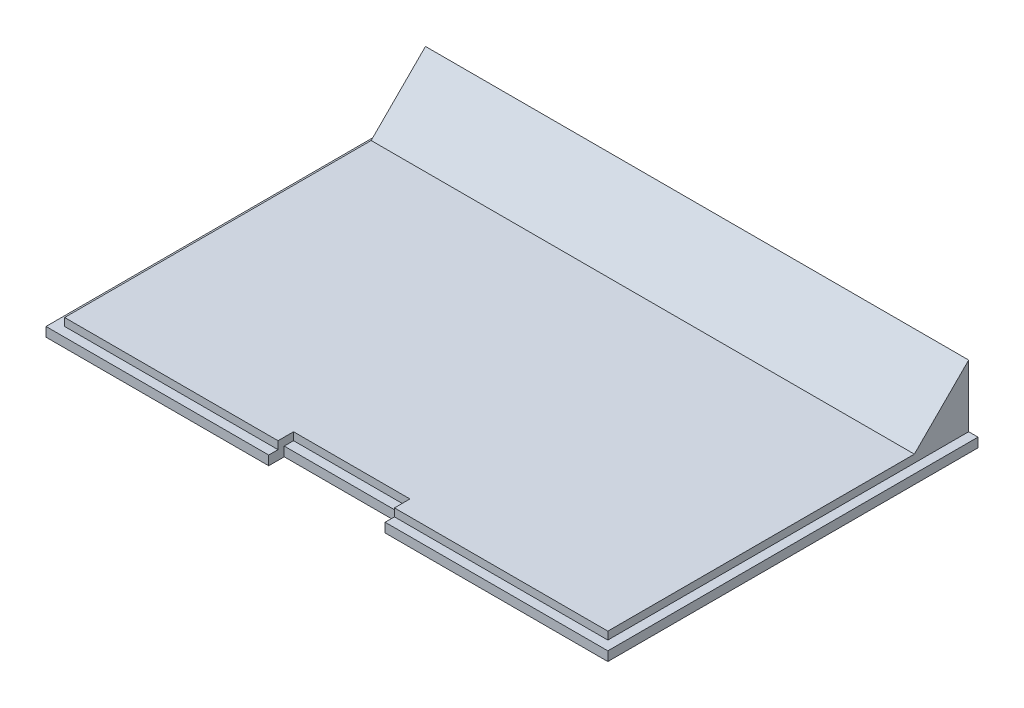
ISO-10303-21;
HEADER;
FILE_DESCRIPTION(('STEP AP214'),'2;1');
FILE_NAME('part.step','',(''),(''),'','','');
FILE_SCHEMA(('AUTOMOTIVE_DESIGN { 1 0 10303 214 1 1 1 1 }'));
ENDSEC;
DATA;
#1=APPLICATION_CONTEXT('core data for automotive mechanical design processes');
#2=APPLICATION_PROTOCOL_DEFINITION('international standard','automotive_design',2000,#1);
#3=PRODUCT_CONTEXT('',#1,'mechanical');
#4=PRODUCT('Part','Part','',(#3));
#5=PRODUCT_RELATED_PRODUCT_CATEGORY('part','',(#4));
#6=PRODUCT_DEFINITION_FORMATION('','',#4);
#7=PRODUCT_DEFINITION_CONTEXT('part definition',#1,'design');
#8=PRODUCT_DEFINITION('design','',#6,#7);
#9=PRODUCT_DEFINITION_SHAPE('','',#8);
#10=(LENGTH_UNIT() NAMED_UNIT(*) SI_UNIT(.MILLI.,.METRE.));
#11=(NAMED_UNIT(*) PLANE_ANGLE_UNIT() SI_UNIT($,.RADIAN.));
#12=(NAMED_UNIT(*) SI_UNIT($,.STERADIAN.) SOLID_ANGLE_UNIT());
#13=UNCERTAINTY_MEASURE_WITH_UNIT(LENGTH_MEASURE(1.E-05),#10,'distance_accuracy_value','');
#14=(GEOMETRIC_REPRESENTATION_CONTEXT(3) GLOBAL_UNCERTAINTY_ASSIGNED_CONTEXT((#13)) GLOBAL_UNIT_ASSIGNED_CONTEXT((#10,
#11,#12)) REPRESENTATION_CONTEXT('',''));
#15=CARTESIAN_POINT('',(0.,0.,0.));
#16=DIRECTION('',(0.,0.,1.));
#17=DIRECTION('',(1.,0.,0.));
#18=AXIS2_PLACEMENT_3D('',#15,#16,#17);
#19=CARTESIAN_POINT('',(0.,1.2,0.));
#20=DIRECTION('',(0.,-1.,0.));
#21=DIRECTION('',(0.,0.,-1.));
#22=AXIS2_PLACEMENT_3D('',#19,#20,#21);
#23=PLANE('',#22);
#24=DIRECTION('',(1.,0.,0.));
#25=VECTOR('',#24,1.);
#26=CARTESIAN_POINT('',(0.,1.2,0.));
#27=LINE('',#26,#25);
#28=CARTESIAN_POINT('',(0.,1.2,0.));
#29=VERTEX_POINT('',#28);
#30=CARTESIAN_POINT('',(28.7,1.2,0.));
#31=VERTEX_POINT('',#30);
#32=EDGE_CURVE('E275',#29,#31,#27,.T.);
#33=ORIENTED_EDGE('',*,*,#32,.T.);
#34=DIRECTION('',(0.,0.,-1.));
#35=VECTOR('',#34,1.);
#36=CARTESIAN_POINT('',(28.7,1.2,0.));
#37=LINE('',#36,#35);
#38=CARTESIAN_POINT('',(28.7,1.2,-1.20000000000001));
#39=VERTEX_POINT('',#38);
#40=EDGE_CURVE('E212',#31,#39,#37,.T.);
#41=ORIENTED_EDGE('',*,*,#40,.T.);
#42=DIRECTION('',(1.,0.,0.));
#43=VECTOR('',#42,1.);
#44=CARTESIAN_POINT('',(1.20000000000001,1.2,-1.20000000000001));
#45=LINE('',#44,#43);
#46=CARTESIAN_POINT('',(1.20000000000001,1.2,-1.20000000000001));
#47=VERTEX_POINT('',#46);
#48=EDGE_CURVE('E246',#47,#39,#45,.T.);
#49=ORIENTED_EDGE('',*,*,#48,.F.);
#50=DIRECTION('',(0.,0.,1.));
#51=VECTOR('',#50,1.);
#52=CARTESIAN_POINT('',(1.20000000000001,1.2,-47.7));
#53=LINE('',#52,#51);
#54=CARTESIAN_POINT('',(1.20000000000001,1.2,-47.7));
#55=VERTEX_POINT('',#54);
#56=EDGE_CURVE('E224',#55,#47,#53,.T.);
#57=ORIENTED_EDGE('',*,*,#56,.F.);
#58=DIRECTION('',(-1.,0.,0.));
#59=VECTOR('',#58,1.);
#60=CARTESIAN_POINT('',(0.,1.2,-47.7));
#61=LINE('',#60,#59);
#62=CARTESIAN_POINT('',(0.,1.2,-47.7));
#63=VERTEX_POINT('',#62);
#64=EDGE_CURVE('E282',#55,#63,#61,.T.);
#65=ORIENTED_EDGE('',*,*,#64,.T.);
#66=DIRECTION('',(0.,0.,1.));
#67=VECTOR('',#66,1.);
#68=CARTESIAN_POINT('',(0.,1.2,0.));
#69=LINE('',#68,#67);
#70=EDGE_CURVE('E269',#63,#29,#69,.T.);
#71=ORIENTED_EDGE('',*,*,#70,.T.);
#72=EDGE_LOOP('',(#33,#41,#49,#57,#65,#71));
#73=FACE_BOUND('',#72,.T.);
#74=ADVANCED_FACE('F40',(#73),#23,.F.);
#75=CARTESIAN_POINT('',(0.,1.2,0.));
#76=DIRECTION('',(0.,0.,-1.));
#77=DIRECTION('',(-1.,0.,0.));
#78=AXIS2_PLACEMENT_3D('',#75,#76,#77);
#79=PLANE('',#78);
#80=DIRECTION('',(1.,0.,0.));
#81=VECTOR('',#80,1.);
#82=CARTESIAN_POINT('',(0.,0.,0.));
#83=LINE('',#82,#81);
#84=CARTESIAN_POINT('',(0.,0.,0.));
#85=VERTEX_POINT('',#84);
#86=CARTESIAN_POINT('',(28.7,0.,0.));
#87=VERTEX_POINT('',#86);
#88=EDGE_CURVE('E291',#85,#87,#83,.T.);
#89=ORIENTED_EDGE('',*,*,#88,.T.);
#90=DIRECTION('',(0.,1.,0.));
#91=VECTOR('',#90,1.);
#92=CARTESIAN_POINT('',(28.7,-7.8,0.));
#93=LINE('',#92,#91);
#94=EDGE_CURVE('E189',#87,#31,#93,.T.);
#95=ORIENTED_EDGE('',*,*,#94,.T.);
#96=ORIENTED_EDGE('',*,*,#32,.F.);
#97=DIRECTION('',(0.,-1.,0.));
#98=VECTOR('',#97,1.);
#99=CARTESIAN_POINT('',(0.,1.2,0.));
#100=LINE('',#99,#98);
#101=EDGE_CURVE('E311',#29,#85,#100,.T.);
#102=ORIENTED_EDGE('',*,*,#101,.T.);
#103=EDGE_LOOP('',(#89,#95,#96,#102));
#104=FACE_BOUND('',#103,.T.);
#105=ADVANCED_FACE('F371',(#104),#79,.F.);
#106=CARTESIAN_POINT('',(1.20000000000001,2.2,-1.20000000000001));
#107=DIRECTION('',(0.,0.,-1.));
#108=DIRECTION('',(-1.,0.,0.));
#109=AXIS2_PLACEMENT_3D('',#106,#107,#108);
#110=PLANE('',#109);
#111=ORIENTED_EDGE('',*,*,#48,.T.);
#112=DIRECTION('',(0.,1.,0.));
#113=VECTOR('',#112,1.);
#114=CARTESIAN_POINT('',(28.7,2.2,-1.20000000000001));
#115=LINE('',#114,#113);
#116=CARTESIAN_POINT('',(28.7,2.2,-1.20000000000001));
#117=VERTEX_POINT('',#116);
#118=EDGE_CURVE('E208',#39,#117,#115,.T.);
#119=ORIENTED_EDGE('',*,*,#118,.T.);
#120=DIRECTION('',(1.,0.,0.));
#121=VECTOR('',#120,1.);
#122=CARTESIAN_POINT('',(1.20000000000001,2.2,-1.20000000000001));
#123=LINE('',#122,#121);
#124=CARTESIAN_POINT('',(1.20000000000001,2.2,-1.20000000000001));
#125=VERTEX_POINT('',#124);
#126=EDGE_CURVE('E233',#125,#117,#123,.T.);
#127=ORIENTED_EDGE('',*,*,#126,.F.);
#128=DIRECTION('',(0.,-1.,0.));
#129=VECTOR('',#128,1.);
#130=CARTESIAN_POINT('',(1.20000000000001,2.2,-1.20000000000001));
#131=LINE('',#130,#129);
#132=EDGE_CURVE('E264',#125,#47,#131,.T.);
#133=ORIENTED_EDGE('',*,*,#132,.T.);
#134=EDGE_LOOP('',(#111,#119,#127,#133));
#135=FACE_BOUND('',#134,.T.);
#136=ADVANCED_FACE('F374',(#135),#110,.F.);
#137=CARTESIAN_POINT('',(43.7,1.2,-1.20000000000001));
#138=VERTEX_POINT('',#137);
#139=CARTESIAN_POINT('',(71.2,1.2,-1.20000000000001));
#140=VERTEX_POINT('',#139);
#141=EDGE_CURVE('E245',#138,#140,#45,.T.);
#142=ORIENTED_EDGE('',*,*,#141,.F.);
#143=DIRECTION('',(0.,0.,1.));
#144=VECTOR('',#143,1.);
#145=CARTESIAN_POINT('',(43.7,1.2,0.));
#146=LINE('',#145,#144);
#147=CARTESIAN_POINT('',(43.7,1.2,0.));
#148=VERTEX_POINT('',#147);
#149=EDGE_CURVE('E199',#138,#148,#146,.T.);
#150=ORIENTED_EDGE('',*,*,#149,.T.);
#151=CARTESIAN_POINT('',(72.4,1.2,0.));
#152=VERTEX_POINT('',#151);
#153=EDGE_CURVE('E273',#148,#152,#27,.T.);
#154=ORIENTED_EDGE('',*,*,#153,.T.);
#155=DIRECTION('',(0.,0.,-1.));
#156=VECTOR('',#155,1.);
#157=CARTESIAN_POINT('',(72.4,1.2,0.));
#158=LINE('',#157,#156);
#159=CARTESIAN_POINT('',(72.4,1.2,-47.7));
#160=VERTEX_POINT('',#159);
#161=EDGE_CURVE('E279',#152,#160,#158,.T.);
#162=ORIENTED_EDGE('',*,*,#161,.T.);
#163=CARTESIAN_POINT('',(71.2,1.2,-47.7));
#164=VERTEX_POINT('',#163);
#165=EDGE_CURVE('E283',#160,#164,#61,.T.);
#166=ORIENTED_EDGE('',*,*,#165,.T.);
#167=DIRECTION('',(0.,0.,-1.));
#168=VECTOR('',#167,1.);
#169=CARTESIAN_POINT('',(71.2,1.2,-47.7));
#170=LINE('',#169,#168);
#171=EDGE_CURVE('E232',#140,#164,#170,.T.);
#172=ORIENTED_EDGE('',*,*,#171,.F.);
#173=EDGE_LOOP('',(#142,#150,#154,#162,#166,#172));
#174=FACE_BOUND('',#173,.T.);
#175=ADVANCED_FACE('F340',(#174),#23,.F.);
#176=CARTESIAN_POINT('',(0.,1.2,0.));
#177=DIRECTION('',(1.,0.,0.));
#178=DIRECTION('',(0.,0.,-1.));
#179=AXIS2_PLACEMENT_3D('',#176,#177,#178);
#180=PLANE('',#179);
#181=DIRECTION('',(0.,0.,1.));
#182=VECTOR('',#181,1.);
#183=CARTESIAN_POINT('',(0.,0.,0.));
#184=LINE('',#183,#182);
#185=CARTESIAN_POINT('',(0.,0.,-47.7));
#186=VERTEX_POINT('',#185);
#187=EDGE_CURVE('E268',#186,#85,#184,.T.);
#188=ORIENTED_EDGE('',*,*,#187,.T.);
#189=ORIENTED_EDGE('',*,*,#101,.F.);
#190=ORIENTED_EDGE('',*,*,#70,.F.);
#191=DIRECTION('',(0.,-1.,0.));
#192=VECTOR('',#191,1.);
#193=CARTESIAN_POINT('',(0.,1.2,-47.7));
#194=LINE('',#193,#192);
#195=EDGE_CURVE('E286',#63,#186,#194,.T.);
#196=ORIENTED_EDGE('',*,*,#195,.T.);
#197=EDGE_LOOP('',(#188,#189,#190,#196));
#198=FACE_BOUND('',#197,.T.);
#199=ADVANCED_FACE('F354',(#198),#180,.F.);
#200=ORIENTED_EDGE('',*,*,#153,.F.);
#201=DIRECTION('',(0.,1.,0.));
#202=VECTOR('',#201,1.);
#203=CARTESIAN_POINT('',(43.7,-7.8,0.));
#204=LINE('',#203,#202);
#205=CARTESIAN_POINT('',(43.7,0.,0.));
#206=VERTEX_POINT('',#205);
#207=EDGE_CURVE('E184',#206,#148,#204,.T.);
#208=ORIENTED_EDGE('',*,*,#207,.F.);
#209=CARTESIAN_POINT('',(72.4,0.,0.));
#210=VERTEX_POINT('',#209);
#211=EDGE_CURVE('E290',#206,#210,#83,.T.);
#212=ORIENTED_EDGE('',*,*,#211,.T.);
#213=DIRECTION('',(0.,-1.,0.));
#214=VECTOR('',#213,1.);
#215=CARTESIAN_POINT('',(72.4,1.2,0.));
#216=LINE('',#215,#214);
#217=EDGE_CURVE('E307',#152,#210,#216,.T.);
#218=ORIENTED_EDGE('',*,*,#217,.F.);
#219=EDGE_LOOP('',(#200,#208,#212,#218));
#220=FACE_BOUND('',#219,.T.);
#221=ADVANCED_FACE('F368',(#220),#79,.F.);
#222=CARTESIAN_POINT('',(72.4,1.2,0.));
#223=DIRECTION('',(-1.,0.,0.));
#224=DIRECTION('',(0.,0.,1.));
#225=AXIS2_PLACEMENT_3D('',#222,#223,#224);
#226=PLANE('',#225);
#227=DIRECTION('',(0.,0.,-1.));
#228=VECTOR('',#227,1.);
#229=CARTESIAN_POINT('',(72.4,0.,0.));
#230=LINE('',#229,#228);
#231=CARTESIAN_POINT('',(72.4,0.,-47.7));
#232=VERTEX_POINT('',#231);
#233=EDGE_CURVE('E295',#210,#232,#230,.T.);
#234=ORIENTED_EDGE('',*,*,#233,.T.);
#235=DIRECTION('',(0.,-1.,0.));
#236=VECTOR('',#235,1.);
#237=CARTESIAN_POINT('',(72.4,1.2,-47.7));
#238=LINE('',#237,#236);
#239=EDGE_CURVE('E303',#160,#232,#238,.T.);
#240=ORIENTED_EDGE('',*,*,#239,.F.);
#241=ORIENTED_EDGE('',*,*,#161,.F.);
#242=ORIENTED_EDGE('',*,*,#217,.T.);
#243=EDGE_LOOP('',(#234,#240,#241,#242));
#244=FACE_BOUND('',#243,.T.);
#245=ADVANCED_FACE('F345',(#244),#226,.F.);
#246=CARTESIAN_POINT('',(0.,1.2,-47.7));
#247=DIRECTION('',(0.,0.,1.));
#248=DIRECTION('',(1.,0.,0.));
#249=AXIS2_PLACEMENT_3D('',#246,#247,#248);
#250=PLANE('',#249);
#251=DIRECTION('',(-1.,0.,0.));
#252=VECTOR('',#251,1.);
#253=CARTESIAN_POINT('',(0.,0.,-47.7));
#254=LINE('',#253,#252);
#255=EDGE_CURVE('E274',#232,#186,#254,.T.);
#256=ORIENTED_EDGE('',*,*,#255,.T.);
#257=ORIENTED_EDGE('',*,*,#195,.F.);
#258=ORIENTED_EDGE('',*,*,#64,.F.);
#259=DIRECTION('',(0.,-1.,0.));
#260=VECTOR('',#259,1.);
#261=CARTESIAN_POINT('',(1.20000000000001,2.2,-47.7));
#262=LINE('',#261,#260);
#263=CARTESIAN_POINT('',(1.20000000000001,9.2,-47.7));
#264=VERTEX_POINT('',#263);
#265=EDGE_CURVE('E241',#264,#55,#262,.T.);
#266=ORIENTED_EDGE('',*,*,#265,.F.);
#267=DIRECTION('',(-1.,0.,0.));
#268=VECTOR('',#267,1.);
#269=CARTESIAN_POINT('',(71.2,9.2,-47.7));
#270=LINE('',#269,#268);
#271=CARTESIAN_POINT('',(71.2,9.2,-47.7));
#272=VERTEX_POINT('',#271);
#273=EDGE_CURVE('E220',#272,#264,#270,.T.);
#274=ORIENTED_EDGE('',*,*,#273,.F.);
#275=DIRECTION('',(0.,-1.,0.));
#276=VECTOR('',#275,1.);
#277=CARTESIAN_POINT('',(71.2,2.2,-47.7));
#278=LINE('',#277,#276);
#279=EDGE_CURVE('E256',#272,#164,#278,.T.);
#280=ORIENTED_EDGE('',*,*,#279,.T.);
#281=ORIENTED_EDGE('',*,*,#165,.F.);
#282=ORIENTED_EDGE('',*,*,#239,.T.);
#283=EDGE_LOOP('',(#256,#257,#258,#266,#274,#280,#281,#282));
#284=FACE_BOUND('',#283,.T.);
#285=ADVANCED_FACE('F328',(#284),#250,.F.);
#286=CARTESIAN_POINT('',(0.,0.,0.));
#287=DIRECTION('',(0.,-1.,0.));
#288=DIRECTION('',(0.,0.,-1.));
#289=AXIS2_PLACEMENT_3D('',#286,#287,#288);
#290=PLANE('',#289);
#291=DIRECTION('',(0.,0.,-1.));
#292=VECTOR('',#291,1.);
#293=CARTESIAN_POINT('',(28.7,0.,0.));
#294=LINE('',#293,#292);
#295=CARTESIAN_POINT('',(28.7,0.,-2.));
#296=VERTEX_POINT('',#295);
#297=EDGE_CURVE('E216',#87,#296,#294,.T.);
#298=ORIENTED_EDGE('',*,*,#297,.F.);
#299=ORIENTED_EDGE('',*,*,#88,.F.);
#300=ORIENTED_EDGE('',*,*,#187,.F.);
#301=ORIENTED_EDGE('',*,*,#255,.F.);
#302=ORIENTED_EDGE('',*,*,#233,.F.);
#303=ORIENTED_EDGE('',*,*,#211,.F.);
#304=DIRECTION('',(0.,0.,1.));
#305=VECTOR('',#304,1.);
#306=CARTESIAN_POINT('',(43.7,0.,0.));
#307=LINE('',#306,#305);
#308=CARTESIAN_POINT('',(43.7,0.,-2.));
#309=VERTEX_POINT('',#308);
#310=EDGE_CURVE('E203',#309,#206,#307,.T.);
#311=ORIENTED_EDGE('',*,*,#310,.F.);
#312=DIRECTION('',(1.,0.,0.));
#313=VECTOR('',#312,1.);
#314=CARTESIAN_POINT('',(0.,0.,-2.));
#315=LINE('',#314,#313);
#316=EDGE_CURVE('E181',#296,#309,#315,.T.);
#317=ORIENTED_EDGE('',*,*,#316,.F.);
#318=EDGE_LOOP('',(#298,#299,#300,#301,#302,#303,#311,#317));
#319=FACE_BOUND('',#318,.T.);
#320=ADVANCED_FACE('F350',(#319),#290,.T.);
#321=CARTESIAN_POINT('',(1.20000000000001,2.2,-47.7));
#322=DIRECTION('',(1.,0.,0.));
#323=DIRECTION('',(0.,0.,-1.));
#324=AXIS2_PLACEMENT_3D('',#321,#322,#323);
#325=PLANE('',#324);
#326=DIRECTION('',(0.,0.,1.));
#327=VECTOR('',#326,1.);
#328=CARTESIAN_POINT('',(1.20000000000001,2.2,-47.7));
#329=LINE('',#328,#327);
#330=CARTESIAN_POINT('',(1.20000000000001,2.2,-40.7));
#331=VERTEX_POINT('',#330);
#332=EDGE_CURVE('E228',#331,#125,#329,.T.);
#333=ORIENTED_EDGE('',*,*,#332,.F.);
#334=DIRECTION('',(0.,-0.70710678118655,0.707106781186545));
#335=VECTOR('',#334,1.);
#336=CARTESIAN_POINT('',(1.20000000000001,9.2,-47.7));
#337=LINE('',#336,#335);
#338=EDGE_CURVE('E50',#331,#264,#337,.F.);
#339=ORIENTED_EDGE('',*,*,#338,.T.);
#340=ORIENTED_EDGE('',*,*,#265,.T.);
#341=ORIENTED_EDGE('',*,*,#56,.T.);
#342=ORIENTED_EDGE('',*,*,#132,.F.);
#343=EDGE_LOOP('',(#333,#339,#340,#341,#342));
#344=FACE_BOUND('',#343,.T.);
#345=ADVANCED_FACE('F322',(#344),#325,.F.);
#346=CARTESIAN_POINT('',(43.7,2.2,-1.20000000000001));
#347=VERTEX_POINT('',#346);
#348=CARTESIAN_POINT('',(71.2,2.2,-1.20000000000001));
#349=VERTEX_POINT('',#348);
#350=EDGE_CURVE('E231',#347,#349,#123,.T.);
#351=ORIENTED_EDGE('',*,*,#350,.F.);
#352=DIRECTION('',(0.,-1.,0.));
#353=VECTOR('',#352,1.);
#354=CARTESIAN_POINT('',(43.7,2.2,-1.20000000000001));
#355=LINE('',#354,#353);
#356=EDGE_CURVE('E64',#347,#138,#355,.T.);
#357=ORIENTED_EDGE('',*,*,#356,.T.);
#358=ORIENTED_EDGE('',*,*,#141,.T.);
#359=DIRECTION('',(0.,-1.,0.));
#360=VECTOR('',#359,1.);
#361=CARTESIAN_POINT('',(71.2,2.2,-1.20000000000001));
#362=LINE('',#361,#360);
#363=EDGE_CURVE('E260',#349,#140,#362,.T.);
#364=ORIENTED_EDGE('',*,*,#363,.F.);
#365=EDGE_LOOP('',(#351,#357,#358,#364));
#366=FACE_BOUND('',#365,.T.);
#367=ADVANCED_FACE('F365',(#366),#110,.F.);
#368=CARTESIAN_POINT('',(71.2,2.2,-47.7));
#369=DIRECTION('',(-1.,0.,0.));
#370=DIRECTION('',(0.,0.,1.));
#371=AXIS2_PLACEMENT_3D('',#368,#369,#370);
#372=PLANE('',#371);
#373=ORIENTED_EDGE('',*,*,#279,.F.);
#374=DIRECTION('',(0.,0.70710678118655,-0.707106781186545));
#375=VECTOR('',#374,1.);
#376=CARTESIAN_POINT('',(71.2,9.2,-47.7));
#377=LINE('',#376,#375);
#378=CARTESIAN_POINT('',(71.2,2.2,-40.7));
#379=VERTEX_POINT('',#378);
#380=EDGE_CURVE('E315',#272,#379,#377,.F.);
#381=ORIENTED_EDGE('',*,*,#380,.T.);
#382=DIRECTION('',(0.,0.,-1.));
#383=VECTOR('',#382,1.);
#384=CARTESIAN_POINT('',(71.2,2.2,-47.7));
#385=LINE('',#384,#383);
#386=EDGE_CURVE('E237',#349,#379,#385,.T.);
#387=ORIENTED_EDGE('',*,*,#386,.F.);
#388=ORIENTED_EDGE('',*,*,#363,.T.);
#389=ORIENTED_EDGE('',*,*,#171,.T.);
#390=EDGE_LOOP('',(#373,#381,#387,#388,#389));
#391=FACE_BOUND('',#390,.T.);
#392=ADVANCED_FACE('F333',(#391),#372,.F.);
#393=CARTESIAN_POINT('',(0.,2.2,0.));
#394=DIRECTION('',(0.,1.,0.));
#395=DIRECTION('',(0.,0.,1.));
#396=AXIS2_PLACEMENT_3D('',#393,#394,#395);
#397=PLANE('',#396);
#398=DIRECTION('',(0.,0.,1.));
#399=VECTOR('',#398,1.);
#400=CARTESIAN_POINT('',(28.7,2.2,0.));
#401=LINE('',#400,#399);
#402=CARTESIAN_POINT('',(28.7,2.2,-3.2));
#403=VERTEX_POINT('',#402);
#404=EDGE_CURVE('E196',#403,#117,#401,.T.);
#405=ORIENTED_EDGE('',*,*,#404,.F.);
#406=DIRECTION('',(-1.,0.,0.));
#407=VECTOR('',#406,1.);
#408=CARTESIAN_POINT('',(28.7,2.2,-3.2));
#409=LINE('',#408,#407);
#410=CARTESIAN_POINT('',(43.7,2.2,-3.2));
#411=VERTEX_POINT('',#410);
#412=EDGE_CURVE('E381',#411,#403,#409,.T.);
#413=ORIENTED_EDGE('',*,*,#412,.F.);
#414=DIRECTION('',(0.,0.,-1.));
#415=VECTOR('',#414,1.);
#416=CARTESIAN_POINT('',(43.7,2.2,0.));
#417=LINE('',#416,#415);
#418=EDGE_CURVE('E11',#347,#411,#417,.T.);
#419=ORIENTED_EDGE('',*,*,#418,.F.);
#420=ORIENTED_EDGE('',*,*,#350,.T.);
#421=ORIENTED_EDGE('',*,*,#386,.T.);
#422=DIRECTION('',(1.,0.,0.));
#423=VECTOR('',#422,1.);
#424=CARTESIAN_POINT('',(71.2,2.2,-40.7));
#425=LINE('',#424,#423);
#426=EDGE_CURVE('E219',#331,#379,#425,.T.);
#427=ORIENTED_EDGE('',*,*,#426,.F.);
#428=ORIENTED_EDGE('',*,*,#332,.T.);
#429=ORIENTED_EDGE('',*,*,#126,.T.);
#430=EDGE_LOOP('',(#405,#413,#419,#420,#421,#427,#428,#429));
#431=FACE_BOUND('',#430,.T.);
#432=ADVANCED_FACE('F377',(#431),#397,.T.);
#433=CARTESIAN_POINT('',(0.,9.2,-47.7));
#434=DIRECTION('',(0.,-0.707106781186545,-0.70710678118655));
#435=DIRECTION('',(1.,0.,0.));
#436=AXIS2_PLACEMENT_3D('',#433,#434,#435);
#437=PLANE('',#436);
#438=ORIENTED_EDGE('',*,*,#338,.F.);
#439=ORIENTED_EDGE('',*,*,#426,.T.);
#440=ORIENTED_EDGE('',*,*,#380,.F.);
#441=ORIENTED_EDGE('',*,*,#273,.T.);
#442=EDGE_LOOP('',(#438,#439,#440,#441));
#443=FACE_BOUND('',#442,.T.);
#444=ADVANCED_FACE('F43',(#443),#437,.F.);
#445=CARTESIAN_POINT('',(28.7,-7.8,0.));
#446=DIRECTION('',(-1.,0.,0.));
#447=DIRECTION('',(0.,0.,1.));
#448=AXIS2_PLACEMENT_3D('',#445,#446,#447);
#449=PLANE('',#448);
#450=ORIENTED_EDGE('',*,*,#297,.T.);
#451=DIRECTION('',(0.,1.,0.));
#452=VECTOR('',#451,1.);
#453=CARTESIAN_POINT('',(28.7,-7.8,-2.));
#454=LINE('',#453,#452);
#455=CARTESIAN_POINT('',(28.7,1.2,-2.));
#456=VERTEX_POINT('',#455);
#457=EDGE_CURVE('E183',#296,#456,#454,.T.);
#458=ORIENTED_EDGE('',*,*,#457,.T.);
#459=DIRECTION('',(0.,0.,1.));
#460=VECTOR('',#459,1.);
#461=CARTESIAN_POINT('',(28.7,1.2,-2.));
#462=LINE('',#461,#460);
#463=CARTESIAN_POINT('',(28.7,1.2,-3.2));
#464=VERTEX_POINT('',#463);
#465=EDGE_CURVE('E57',#464,#456,#462,.T.);
#466=ORIENTED_EDGE('',*,*,#465,.F.);
#467=DIRECTION('',(0.,1.,0.));
#468=VECTOR('',#467,1.);
#469=CARTESIAN_POINT('',(28.7,1.2,-3.2));
#470=LINE('',#469,#468);
#471=EDGE_CURVE('E385',#464,#403,#470,.T.);
#472=ORIENTED_EDGE('',*,*,#471,.T.);
#473=ORIENTED_EDGE('',*,*,#404,.T.);
#474=ORIENTED_EDGE('',*,*,#118,.F.);
#475=ORIENTED_EDGE('',*,*,#40,.F.);
#476=ORIENTED_EDGE('',*,*,#94,.F.);
#477=EDGE_LOOP('',(#450,#458,#466,#472,#473,#474,#475,#476));
#478=FACE_BOUND('',#477,.T.);
#479=ADVANCED_FACE('F372',(#478),#449,.F.);
#480=CARTESIAN_POINT('',(43.7,-7.8,0.));
#481=DIRECTION('',(1.,0.,0.));
#482=DIRECTION('',(0.,0.,-1.));
#483=AXIS2_PLACEMENT_3D('',#480,#481,#482);
#484=PLANE('',#483);
#485=ORIENTED_EDGE('',*,*,#310,.T.);
#486=ORIENTED_EDGE('',*,*,#207,.T.);
#487=ORIENTED_EDGE('',*,*,#149,.F.);
#488=ORIENTED_EDGE('',*,*,#356,.F.);
#489=ORIENTED_EDGE('',*,*,#418,.T.);
#490=DIRECTION('',(0.,1.,0.));
#491=VECTOR('',#490,1.);
#492=CARTESIAN_POINT('',(43.7,1.2,-3.2));
#493=LINE('',#492,#491);
#494=CARTESIAN_POINT('',(43.7,1.2,-3.2));
#495=VERTEX_POINT('',#494);
#496=EDGE_CURVE('E167',#495,#411,#493,.T.);
#497=ORIENTED_EDGE('',*,*,#496,.F.);
#498=DIRECTION('',(0.,0.,-1.));
#499=VECTOR('',#498,1.);
#500=CARTESIAN_POINT('',(43.7,1.2,-2.));
#501=LINE('',#500,#499);
#502=CARTESIAN_POINT('',(43.7,1.2,-2.));
#503=VERTEX_POINT('',#502);
#504=EDGE_CURVE('E161',#503,#495,#501,.T.);
#505=ORIENTED_EDGE('',*,*,#504,.F.);
#506=DIRECTION('',(0.,1.,0.));
#507=VECTOR('',#506,1.);
#508=CARTESIAN_POINT('',(43.7,-7.8,-2.));
#509=LINE('',#508,#507);
#510=EDGE_CURVE('E164',#309,#503,#509,.T.);
#511=ORIENTED_EDGE('',*,*,#510,.F.);
#512=EDGE_LOOP('',(#485,#486,#487,#488,#489,#497,#505,#511));
#513=FACE_BOUND('',#512,.T.);
#514=ADVANCED_FACE('F162',(#513),#484,.F.);
#515=CARTESIAN_POINT('',(28.7,-7.8,-2.));
#516=DIRECTION('',(0.,0.,-1.));
#517=DIRECTION('',(-1.,0.,0.));
#518=AXIS2_PLACEMENT_3D('',#515,#516,#517);
#519=PLANE('',#518);
#520=ORIENTED_EDGE('',*,*,#510,.T.);
#521=DIRECTION('',(1.,0.,0.));
#522=VECTOR('',#521,1.);
#523=CARTESIAN_POINT('',(28.7,1.2,-2.));
#524=LINE('',#523,#522);
#525=EDGE_CURVE('E171',#456,#503,#524,.T.);
#526=ORIENTED_EDGE('',*,*,#525,.F.);
#527=ORIENTED_EDGE('',*,*,#457,.F.);
#528=ORIENTED_EDGE('',*,*,#316,.T.);
#529=EDGE_LOOP('',(#520,#526,#527,#528));
#530=FACE_BOUND('',#529,.T.);
#531=ADVANCED_FACE('F179',(#530),#519,.F.);
#532=CARTESIAN_POINT('',(28.7,1.2,-3.2));
#533=DIRECTION('',(0.,0.,-1.));
#534=DIRECTION('',(-1.,0.,0.));
#535=AXIS2_PLACEMENT_3D('',#532,#533,#534);
#536=PLANE('',#535);
#537=ORIENTED_EDGE('',*,*,#412,.T.);
#538=ORIENTED_EDGE('',*,*,#471,.F.);
#539=DIRECTION('',(-1.,0.,0.));
#540=VECTOR('',#539,1.);
#541=CARTESIAN_POINT('',(28.7,1.2,-3.2));
#542=LINE('',#541,#540);
#543=EDGE_CURVE('E170',#495,#464,#542,.T.);
#544=ORIENTED_EDGE('',*,*,#543,.F.);
#545=ORIENTED_EDGE('',*,*,#496,.T.);
#546=EDGE_LOOP('',(#537,#538,#544,#545));
#547=FACE_BOUND('',#546,.T.);
#548=ADVANCED_FACE('F383',(#547),#536,.F.);
#549=CARTESIAN_POINT('',(0.,1.2,0.));
#550=DIRECTION('',(0.,-1.,0.));
#551=DIRECTION('',(0.,0.,-1.));
#552=AXIS2_PLACEMENT_3D('',#549,#550,#551);
#553=PLANE('',#552);
#554=ORIENTED_EDGE('',*,*,#465,.T.);
#555=ORIENTED_EDGE('',*,*,#525,.T.);
#556=ORIENTED_EDGE('',*,*,#504,.T.);
#557=ORIENTED_EDGE('',*,*,#543,.T.);
#558=EDGE_LOOP('',(#554,#555,#556,#557));
#559=FACE_BOUND('',#558,.T.);
#560=ADVANCED_FACE('F173',(#559),#553,.F.);
#561=CLOSED_SHELL('',(#74,#105,#136,#175,#199,#221,#245,#285,#320,#345,#367,#392,#432,#444,#479,
#514,#531,#548,#560));
#562=MANIFOLD_SOLID_BREP('B2',#561);
#563=ADVANCED_BREP_SHAPE_REPRESENTATION('',(#18,#562),#14);
#564=SHAPE_DEFINITION_REPRESENTATION(#9,#563);
ENDSEC;
END-ISO-10303-21;
